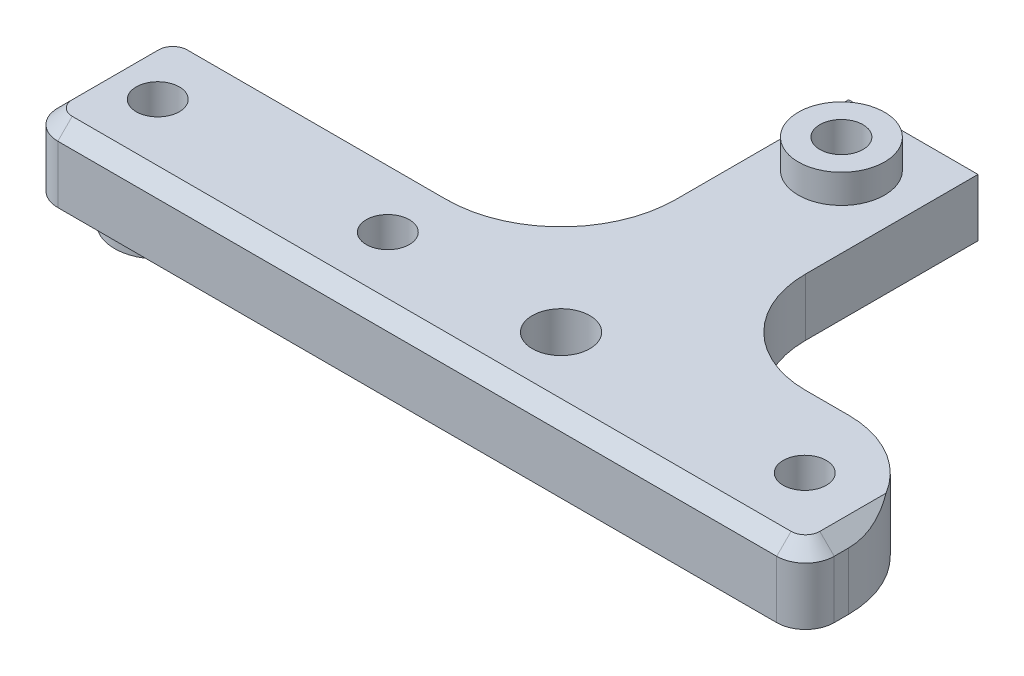
ISO-10303-21;
HEADER;
FILE_DESCRIPTION(('STEP AP214'),'2;1');
FILE_NAME('part.step','',(''),(''),'','','');
FILE_SCHEMA(('AUTOMOTIVE_DESIGN { 1 0 10303 214 1 1 1 1 }'));
ENDSEC;
DATA;
#1=APPLICATION_CONTEXT('core data for automotive mechanical design processes');
#2=APPLICATION_PROTOCOL_DEFINITION('international standard','automotive_design',2000,#1);
#3=PRODUCT_CONTEXT('',#1,'mechanical');
#4=PRODUCT('Part','Part','',(#3));
#5=PRODUCT_RELATED_PRODUCT_CATEGORY('part','',(#4));
#6=PRODUCT_DEFINITION_FORMATION('','',#4);
#7=PRODUCT_DEFINITION_CONTEXT('part definition',#1,'design');
#8=PRODUCT_DEFINITION('design','',#6,#7);
#9=PRODUCT_DEFINITION_SHAPE('','',#8);
#10=(LENGTH_UNIT() NAMED_UNIT(*) SI_UNIT(.MILLI.,.METRE.));
#11=(NAMED_UNIT(*) PLANE_ANGLE_UNIT() SI_UNIT($,.RADIAN.));
#12=(NAMED_UNIT(*) SI_UNIT($,.STERADIAN.) SOLID_ANGLE_UNIT());
#13=UNCERTAINTY_MEASURE_WITH_UNIT(LENGTH_MEASURE(1.E-05),#10,'distance_accuracy_value','');
#14=(GEOMETRIC_REPRESENTATION_CONTEXT(3) GLOBAL_UNCERTAINTY_ASSIGNED_CONTEXT((#13)) GLOBAL_UNIT_ASSIGNED_CONTEXT((#10,
#11,#12)) REPRESENTATION_CONTEXT('',''));
#15=CARTESIAN_POINT('',(0.,0.,0.));
#16=DIRECTION('',(0.,0.,1.));
#17=DIRECTION('',(1.,0.,0.));
#18=AXIS2_PLACEMENT_3D('',#15,#16,#17);
#19=CARTESIAN_POINT('',(-27.,5.,-5.));
#20=DIRECTION('',(0.,0.,1.));
#21=DIRECTION('',(1.,0.,0.));
#22=AXIS2_PLACEMENT_3D('',#19,#20,#21);
#23=PLANE('',#22);
#24=DIRECTION('',(-1.,0.,0.));
#25=VECTOR('',#24,1.);
#26=CARTESIAN_POINT('',(-27.,5.,-5.));
#27=LINE('',#26,#25);
#28=CARTESIAN_POINT('',(20.,5.,-5.));
#29=VERTEX_POINT('',#28);
#30=CARTESIAN_POINT('',(17.,5.,-5.));
#31=VERTEX_POINT('',#30);
#32=EDGE_CURVE('E266',#29,#31,#27,.T.);
#33=ORIENTED_EDGE('',*,*,#32,.F.);
#34=DIRECTION('',(0.,-1.,0.));
#35=VECTOR('',#34,1.);
#36=CARTESIAN_POINT('',(20.,5.,-5.));
#37=LINE('',#36,#35);
#38=CARTESIAN_POINT('',(20.,1.,-5.));
#39=VERTEX_POINT('',#38);
#40=EDGE_CURVE('E424',#29,#39,#37,.T.);
#41=ORIENTED_EDGE('',*,*,#40,.T.);
#42=DIRECTION('',(-1.,0.,0.));
#43=VECTOR('',#42,1.);
#44=CARTESIAN_POINT('',(-27.,1.,-5.));
#45=LINE('',#44,#43);
#46=CARTESIAN_POINT('',(17.,1.,-5.));
#47=VERTEX_POINT('',#46);
#48=EDGE_CURVE('E368',#39,#47,#45,.T.);
#49=ORIENTED_EDGE('',*,*,#48,.T.);
#50=DIRECTION('',(0.,-1.,0.));
#51=VECTOR('',#50,1.);
#52=CARTESIAN_POINT('',(17.,5.,-5.));
#53=LINE('',#52,#51);
#54=EDGE_CURVE('E339',#47,#31,#53,.F.);
#55=ORIENTED_EDGE('',*,*,#54,.T.);
#56=EDGE_LOOP('',(#33,#41,#49,#55));
#57=FACE_BOUND('',#56,.T.);
#58=ADVANCED_FACE('F47',(#57),#23,.F.);
#59=DIRECTION('',(0.,-1.,0.));
#60=VECTOR('',#59,1.);
#61=CARTESIAN_POINT('',(-25.,5.,-5.));
#62=LINE('',#61,#60);
#63=CARTESIAN_POINT('',(-25.,0.,-5.));
#64=VERTEX_POINT('',#63);
#65=CARTESIAN_POINT('',(-25.,4.00000000000001,-5.));
#66=VERTEX_POINT('',#65);
#67=EDGE_CURVE('E311',#64,#66,#62,.F.);
#68=ORIENTED_EDGE('',*,*,#67,.T.);
#69=DIRECTION('',(1.,0.,0.));
#70=VECTOR('',#69,1.);
#71=CARTESIAN_POINT('',(-7.00000000000001,4.00000000000001,-5.));
#72=LINE('',#71,#70);
#73=CARTESIAN_POINT('',(-7.00000000000001,4.00000000000001,-5.));
#74=VERTEX_POINT('',#73);
#75=EDGE_CURVE('E410',#66,#74,#72,.T.);
#76=ORIENTED_EDGE('',*,*,#75,.T.);
#77=DIRECTION('',(0.,1.,0.));
#78=VECTOR('',#77,1.);
#79=CARTESIAN_POINT('',(-7.00000000000001,0.,-5.));
#80=LINE('',#79,#78);
#81=CARTESIAN_POINT('',(-7.00000000000001,0.,-5.));
#82=VERTEX_POINT('',#81);
#83=EDGE_CURVE('E332',#74,#82,#80,.F.);
#84=ORIENTED_EDGE('',*,*,#83,.T.);
#85=DIRECTION('',(-1.,0.,0.));
#86=VECTOR('',#85,1.);
#87=CARTESIAN_POINT('',(-27.,0.,-5.));
#88=LINE('',#87,#86);
#89=EDGE_CURVE('E274',#82,#64,#88,.T.);
#90=ORIENTED_EDGE('',*,*,#89,.T.);
#91=EDGE_LOOP('',(#68,#76,#84,#90));
#92=FACE_BOUND('',#91,.T.);
#93=ADVANCED_FACE('F591',(#92),#23,.F.);
#94=CARTESIAN_POINT('',(27.,5.,-5.));
#95=DIRECTION('',(-1.,0.,0.));
#96=DIRECTION('',(0.,0.,1.));
#97=AXIS2_PLACEMENT_3D('',#94,#95,#96);
#98=PLANE('',#97);
#99=DIRECTION('',(0.,0.,-1.));
#100=VECTOR('',#99,1.);
#101=CARTESIAN_POINT('',(27.,0.,-5.));
#102=LINE('',#101,#100);
#103=CARTESIAN_POINT('',(27.,0.,3.));
#104=VERTEX_POINT('',#103);
#105=CARTESIAN_POINT('',(27.,0.,2.));
#106=VERTEX_POINT('',#105);
#107=EDGE_CURVE('E272',#104,#106,#102,.T.);
#108=ORIENTED_EDGE('',*,*,#107,.T.);
#109=DIRECTION('',(0.,-1.,0.));
#110=VECTOR('',#109,1.);
#111=CARTESIAN_POINT('',(27.,5.,2.));
#112=LINE('',#111,#110);
#113=CARTESIAN_POINT('',(27.,4.00000000000001,2.));
#114=VERTEX_POINT('',#113);
#115=EDGE_CURVE('E72',#106,#114,#112,.F.);
#116=ORIENTED_EDGE('',*,*,#115,.T.);
#117=DIRECTION('',(0.,0.,1.));
#118=VECTOR('',#117,1.);
#119=CARTESIAN_POINT('',(27.,4.00000000000001,3.));
#120=LINE('',#119,#118);
#121=CARTESIAN_POINT('',(27.,4.00000000000001,3.));
#122=VERTEX_POINT('',#121);
#123=EDGE_CURVE('E371',#114,#122,#120,.T.);
#124=ORIENTED_EDGE('',*,*,#123,.T.);
#125=DIRECTION('',(0.,-1.,0.));
#126=VECTOR('',#125,1.);
#127=CARTESIAN_POINT('',(27.,5.,3.));
#128=LINE('',#127,#126);
#129=EDGE_CURVE('E314',#122,#104,#128,.T.);
#130=ORIENTED_EDGE('',*,*,#129,.T.);
#131=EDGE_LOOP('',(#108,#116,#124,#130));
#132=FACE_BOUND('',#131,.T.);
#133=ADVANCED_FACE('F516',(#132),#98,.F.);
#134=CARTESIAN_POINT('',(-27.,5.,-5.));
#135=DIRECTION('',(1.,0.,0.));
#136=DIRECTION('',(0.,0.,-1.));
#137=AXIS2_PLACEMENT_3D('',#134,#135,#136);
#138=PLANE('',#137);
#139=DIRECTION('',(0.,-1.,0.));
#140=VECTOR('',#139,1.);
#141=CARTESIAN_POINT('',(-27.,5.,3.));
#142=LINE('',#141,#140);
#143=CARTESIAN_POINT('',(-27.,0.,3.));
#144=VERTEX_POINT('',#143);
#145=CARTESIAN_POINT('',(-27.,4.00000000000001,3.));
#146=VERTEX_POINT('',#145);
#147=EDGE_CURVE('E268',#144,#146,#142,.F.);
#148=ORIENTED_EDGE('',*,*,#147,.T.);
#149=DIRECTION('',(0.,0.,-1.));
#150=VECTOR('',#149,1.);
#151=CARTESIAN_POINT('',(-27.,4.00000000000001,-3.));
#152=LINE('',#151,#150);
#153=CARTESIAN_POINT('',(-27.,4.00000000000001,-3.));
#154=VERTEX_POINT('',#153);
#155=EDGE_CURVE('E411',#146,#154,#152,.T.);
#156=ORIENTED_EDGE('',*,*,#155,.T.);
#157=DIRECTION('',(0.,-1.,0.));
#158=VECTOR('',#157,1.);
#159=CARTESIAN_POINT('',(-27.,5.,-3.));
#160=LINE('',#159,#158);
#161=CARTESIAN_POINT('',(-27.,0.,-3.));
#162=VERTEX_POINT('',#161);
#163=EDGE_CURVE('E296',#154,#162,#160,.T.);
#164=ORIENTED_EDGE('',*,*,#163,.T.);
#165=DIRECTION('',(0.,0.,1.));
#166=VECTOR('',#165,1.);
#167=CARTESIAN_POINT('',(-27.,0.,-5.));
#168=LINE('',#167,#166);
#169=EDGE_CURVE('E276',#162,#144,#168,.T.);
#170=ORIENTED_EDGE('',*,*,#169,.T.);
#171=EDGE_LOOP('',(#148,#156,#164,#170));
#172=FACE_BOUND('',#171,.T.);
#173=ADVANCED_FACE('F536',(#172),#138,.F.);
#174=CARTESIAN_POINT('',(-27.,5.,5.));
#175=DIRECTION('',(0.,0.,-1.));
#176=DIRECTION('',(-1.,0.,0.));
#177=AXIS2_PLACEMENT_3D('',#174,#175,#176);
#178=PLANE('',#177);
#179=DIRECTION('',(0.,-1.,0.));
#180=VECTOR('',#179,1.);
#181=CARTESIAN_POINT('',(25.,5.,5.));
#182=LINE('',#181,#180);
#183=CARTESIAN_POINT('',(25.,0.,5.));
#184=VERTEX_POINT('',#183);
#185=CARTESIAN_POINT('',(25.,4.00000000000001,5.));
#186=VERTEX_POINT('',#185);
#187=EDGE_CURVE('E248',#184,#186,#182,.F.);
#188=ORIENTED_EDGE('',*,*,#187,.T.);
#189=DIRECTION('',(-1.,0.,0.));
#190=VECTOR('',#189,1.);
#191=CARTESIAN_POINT('',(-25.,4.00000000000001,5.));
#192=LINE('',#191,#190);
#193=CARTESIAN_POINT('',(-25.,4.00000000000001,5.));
#194=VERTEX_POINT('',#193);
#195=EDGE_CURVE('E418',#186,#194,#192,.T.);
#196=ORIENTED_EDGE('',*,*,#195,.T.);
#197=DIRECTION('',(0.,-1.,0.));
#198=VECTOR('',#197,1.);
#199=CARTESIAN_POINT('',(-25.,5.,5.));
#200=LINE('',#199,#198);
#201=CARTESIAN_POINT('',(-25.,0.,5.));
#202=VERTEX_POINT('',#201);
#203=EDGE_CURVE('E319',#194,#202,#200,.T.);
#204=ORIENTED_EDGE('',*,*,#203,.T.);
#205=DIRECTION('',(1.,0.,0.));
#206=VECTOR('',#205,1.);
#207=CARTESIAN_POINT('',(-27.,0.,5.));
#208=LINE('',#207,#206);
#209=EDGE_CURVE('E270',#202,#184,#208,.T.);
#210=ORIENTED_EDGE('',*,*,#209,.T.);
#211=EDGE_LOOP('',(#188,#196,#204,#210));
#212=FACE_BOUND('',#211,.T.);
#213=ADVANCED_FACE('F527',(#212),#178,.F.);
#214=CARTESIAN_POINT('',(0.,5.,0.));
#215=DIRECTION('',(0.,1.,0.));
#216=DIRECTION('',(0.,0.,1.));
#217=AXIS2_PLACEMENT_3D('',#214,#215,#216);
#218=PLANE('',#217);
#219=CARTESIAN_POINT('',(4.99999999999999,5.,-19.5));
#220=DIRECTION('',(0.,1.,0.));
#221=DIRECTION('',(0.,0.,1.));
#222=AXIS2_PLACEMENT_3D('',#219,#220,#221);
#223=CIRCLE('',#222,3.);
#224=CARTESIAN_POINT('',(4.99999999999999,5.,-16.5));
#225=VERTEX_POINT('',#224);
#226=EDGE_CURVE('E247',#225,#225,#223,.T.);
#227=ORIENTED_EDGE('',*,*,#226,.F.);
#228=EDGE_LOOP('',(#227));
#229=FACE_BOUND('',#228,.T.);
#230=CARTESIAN_POINT('',(-23.05,5.,0.));
#231=DIRECTION('',(0.,1.,0.));
#232=DIRECTION('',(0.,0.,1.));
#233=AXIS2_PLACEMENT_3D('',#230,#231,#232);
#234=CIRCLE('',#233,1.5);
#235=CARTESIAN_POINT('',(-23.05,5.,1.5));
#236=VERTEX_POINT('',#235);
#237=EDGE_CURVE('E249',#236,#236,#234,.T.);
#238=ORIENTED_EDGE('',*,*,#237,.F.);
#239=EDGE_LOOP('',(#238));
#240=FACE_BOUND('',#239,.T.);
#241=CARTESIAN_POINT('',(5.,5.,0.));
#242=DIRECTION('',(0.,1.,0.));
#243=DIRECTION('',(0.,0.,1.));
#244=AXIS2_PLACEMENT_3D('',#241,#242,#243);
#245=CIRCLE('',#244,2.);
#246=CARTESIAN_POINT('',(5.,5.,2.));
#247=VERTEX_POINT('',#246);
#248=EDGE_CURVE('E253',#247,#247,#245,.T.);
#249=ORIENTED_EDGE('',*,*,#248,.F.);
#250=EDGE_LOOP('',(#249));
#251=FACE_BOUND('',#250,.T.);
#252=CARTESIAN_POINT('',(-7.05,5.,0.));
#253=DIRECTION('',(0.,1.,0.));
#254=DIRECTION('',(0.,0.,1.));
#255=AXIS2_PLACEMENT_3D('',#252,#253,#254);
#256=CIRCLE('',#255,1.5);
#257=CARTESIAN_POINT('',(-7.05,5.,1.5));
#258=VERTEX_POINT('',#257);
#259=EDGE_CURVE('E259',#258,#258,#256,.T.);
#260=ORIENTED_EDGE('',*,*,#259,.F.);
#261=EDGE_LOOP('',(#260));
#262=FACE_BOUND('',#261,.T.);
#263=CARTESIAN_POINT('',(21.95,5.,0.));
#264=DIRECTION('',(0.,1.,0.));
#265=DIRECTION('',(0.,0.,1.));
#266=AXIS2_PLACEMENT_3D('',#263,#264,#265);
#267=CIRCLE('',#266,1.5);
#268=CARTESIAN_POINT('',(21.95,5.,1.5));
#269=VERTEX_POINT('',#268);
#270=EDGE_CURVE('E243',#269,#269,#267,.T.);
#271=ORIENTED_EDGE('',*,*,#270,.F.);
#272=EDGE_LOOP('',(#271));
#273=FACE_BOUND('',#272,.T.);
#274=DIRECTION('',(0.,0.,-1.));
#275=VECTOR('',#274,1.);
#276=CARTESIAN_POINT('',(26.,5.,-5.));
#277=LINE('',#276,#275);
#278=CARTESIAN_POINT('',(26.,5.,3.));
#279=VERTEX_POINT('',#278);
#280=CARTESIAN_POINT('',(26.,5.,-1.60555127546398));
#281=VERTEX_POINT('',#280);
#282=EDGE_CURVE('E372',#279,#281,#277,.T.);
#283=ORIENTED_EDGE('',*,*,#282,.T.);
#284=CARTESIAN_POINT('',(20.,5.,2.));
#285=DIRECTION('',(0.,1.,0.));
#286=DIRECTION('',(0.,0.,1.));
#287=AXIS2_PLACEMENT_3D('',#284,#285,#286);
#288=CIRCLE('',#287,7.);
#289=EDGE_CURVE('E11',#281,#29,#288,.T.);
#290=ORIENTED_EDGE('',*,*,#289,.T.);
#291=ORIENTED_EDGE('',*,*,#32,.T.);
#292=CARTESIAN_POINT('',(17.,5.,-12.));
#293=DIRECTION('',(0.,1.,0.));
#294=DIRECTION('',(0.,0.,1.));
#295=AXIS2_PLACEMENT_3D('',#292,#293,#294);
#296=CIRCLE('',#295,7.);
#297=CARTESIAN_POINT('',(9.99999999999999,5.,-12.));
#298=VERTEX_POINT('',#297);
#299=EDGE_CURVE('E342',#31,#298,#296,.F.);
#300=ORIENTED_EDGE('',*,*,#299,.T.);
#301=DIRECTION('',(0.,0.,1.));
#302=VECTOR('',#301,1.);
#303=CARTESIAN_POINT('',(9.99999999999999,5.,-24.));
#304=LINE('',#303,#302);
#305=CARTESIAN_POINT('',(9.99999999999999,5.,-24.));
#306=VERTEX_POINT('',#305);
#307=EDGE_CURVE('E219',#306,#298,#304,.T.);
#308=ORIENTED_EDGE('',*,*,#307,.F.);
#309=DIRECTION('',(1.,0.,0.));
#310=VECTOR('',#309,1.);
#311=CARTESIAN_POINT('',(9.99999999999999,5.,-24.));
#312=LINE('',#311,#310);
#313=CARTESIAN_POINT('',(0.999999999999987,5.,-24.));
#314=VERTEX_POINT('',#313);
#315=EDGE_CURVE('E228',#314,#306,#312,.T.);
#316=ORIENTED_EDGE('',*,*,#315,.F.);
#317=DIRECTION('',(0.,0.,1.));
#318=VECTOR('',#317,1.);
#319=CARTESIAN_POINT('',(0.999999999999987,5.,-12.));
#320=LINE('',#319,#318);
#321=CARTESIAN_POINT('',(0.999999999999987,5.,-12.));
#322=VERTEX_POINT('',#321);
#323=EDGE_CURVE('E399',#314,#322,#320,.T.);
#324=ORIENTED_EDGE('',*,*,#323,.T.);
#325=CARTESIAN_POINT('',(-7.00000000000001,5.,-12.));
#326=DIRECTION('',(0.,1.,0.));
#327=DIRECTION('',(0.,0.,1.));
#328=AXIS2_PLACEMENT_3D('',#325,#326,#327);
#329=CIRCLE('',#328,7.99999999999999);
#330=CARTESIAN_POINT('',(-7.00000000000001,5.,-4.00000000000001));
#331=VERTEX_POINT('',#330);
#332=EDGE_CURVE('E394',#322,#331,#329,.F.);
#333=ORIENTED_EDGE('',*,*,#332,.T.);
#334=DIRECTION('',(-1.,0.,0.));
#335=VECTOR('',#334,1.);
#336=CARTESIAN_POINT('',(-25.,5.,-4.00000000000001));
#337=LINE('',#336,#335);
#338=CARTESIAN_POINT('',(-25.,5.,-4.));
#339=VERTEX_POINT('',#338);
#340=EDGE_CURVE('E395',#331,#339,#337,.T.);
#341=ORIENTED_EDGE('',*,*,#340,.T.);
#342=CARTESIAN_POINT('',(-25.,5.,-3.));
#343=DIRECTION('',(0.,1.,0.));
#344=DIRECTION('',(0.,0.,1.));
#345=AXIS2_PLACEMENT_3D('',#342,#343,#344);
#346=CIRCLE('',#345,1.);
#347=CARTESIAN_POINT('',(-26.,5.,-3.));
#348=VERTEX_POINT('',#347);
#349=EDGE_CURVE('E389',#339,#348,#346,.T.);
#350=ORIENTED_EDGE('',*,*,#349,.T.);
#351=DIRECTION('',(0.,0.,1.));
#352=VECTOR('',#351,1.);
#353=CARTESIAN_POINT('',(-26.,5.,3.));
#354=LINE('',#353,#352);
#355=CARTESIAN_POINT('',(-26.,5.,3.));
#356=VERTEX_POINT('',#355);
#357=EDGE_CURVE('E388',#348,#356,#354,.T.);
#358=ORIENTED_EDGE('',*,*,#357,.T.);
#359=CARTESIAN_POINT('',(-25.,5.,3.));
#360=DIRECTION('',(0.,1.,0.));
#361=DIRECTION('',(0.,0.,1.));
#362=AXIS2_PLACEMENT_3D('',#359,#360,#361);
#363=CIRCLE('',#362,1.);
#364=CARTESIAN_POINT('',(-25.,5.,4.00000000000001));
#365=VERTEX_POINT('',#364);
#366=EDGE_CURVE('E384',#356,#365,#363,.T.);
#367=ORIENTED_EDGE('',*,*,#366,.T.);
#368=DIRECTION('',(1.,0.,0.));
#369=VECTOR('',#368,1.);
#370=CARTESIAN_POINT('',(25.,5.,4.00000000000001));
#371=LINE('',#370,#369);
#372=CARTESIAN_POINT('',(25.,5.,4.));
#373=VERTEX_POINT('',#372);
#374=EDGE_CURVE('E379',#365,#373,#371,.T.);
#375=ORIENTED_EDGE('',*,*,#374,.T.);
#376=CARTESIAN_POINT('',(25.,5.,3.));
#377=DIRECTION('',(0.,1.,0.));
#378=DIRECTION('',(0.,0.,1.));
#379=AXIS2_PLACEMENT_3D('',#376,#377,#378);
#380=CIRCLE('',#379,1.);
#381=EDGE_CURVE('E380',#373,#279,#380,.T.);
#382=ORIENTED_EDGE('',*,*,#381,.T.);
#383=EDGE_LOOP('',(#283,#290,#291,#300,#308,#316,#324,#333,#341,#350,#358,#367,#375,#382));
#384=FACE_BOUND('',#383,.T.);
#385=ADVANCED_FACE('F509',(#229,#240,#251,#262,#273,#384),#218,.T.);
#386=CARTESIAN_POINT('',(0.,0.,0.));
#387=DIRECTION('',(0.,1.,0.));
#388=DIRECTION('',(0.,0.,1.));
#389=AXIS2_PLACEMENT_3D('',#386,#387,#388);
#390=PLANE('',#389);
#391=CARTESIAN_POINT('',(4.99999999999999,0.,-19.5));
#392=DIRECTION('',(0.,1.,0.));
#393=DIRECTION('',(0.,0.,1.));
#394=AXIS2_PLACEMENT_3D('',#391,#392,#393);
#395=CIRCLE('',#394,1.5);
#396=CARTESIAN_POINT('',(4.99999999999999,0.,-18.));
#397=VERTEX_POINT('',#396);
#398=EDGE_CURVE('E324',#397,#397,#395,.T.);
#399=ORIENTED_EDGE('',*,*,#398,.T.);
#400=EDGE_LOOP('',(#399));
#401=FACE_BOUND('',#400,.T.);
#402=CARTESIAN_POINT('',(-23.05,0.,0.));
#403=DIRECTION('',(0.,-1.,0.));
#404=DIRECTION('',(0.,0.,-1.));
#405=AXIS2_PLACEMENT_3D('',#402,#403,#404);
#406=CIRCLE('',#405,3.);
#407=CARTESIAN_POINT('',(-23.05,0.,-3.));
#408=VERTEX_POINT('',#407);
#409=EDGE_CURVE('E242',#408,#408,#406,.T.);
#410=ORIENTED_EDGE('',*,*,#409,.F.);
#411=EDGE_LOOP('',(#410));
#412=FACE_BOUND('',#411,.T.);
#413=CARTESIAN_POINT('',(5.,0.,0.));
#414=DIRECTION('',(0.,1.,0.));
#415=DIRECTION('',(0.,0.,1.));
#416=AXIS2_PLACEMENT_3D('',#413,#414,#415);
#417=CIRCLE('',#416,2.);
#418=CARTESIAN_POINT('',(5.,0.,2.));
#419=VERTEX_POINT('',#418);
#420=EDGE_CURVE('E273',#419,#419,#417,.T.);
#421=ORIENTED_EDGE('',*,*,#420,.T.);
#422=EDGE_LOOP('',(#421));
#423=FACE_BOUND('',#422,.T.);
#424=CARTESIAN_POINT('',(-7.05,0.,0.));
#425=DIRECTION('',(0.,1.,0.));
#426=DIRECTION('',(0.,0.,1.));
#427=AXIS2_PLACEMENT_3D('',#424,#425,#426);
#428=CIRCLE('',#427,1.5);
#429=CARTESIAN_POINT('',(-7.05,0.,1.5));
#430=VERTEX_POINT('',#429);
#431=EDGE_CURVE('E289',#430,#430,#428,.T.);
#432=ORIENTED_EDGE('',*,*,#431,.T.);
#433=EDGE_LOOP('',(#432));
#434=FACE_BOUND('',#433,.T.);
#435=CARTESIAN_POINT('',(21.95,0.,0.));
#436=DIRECTION('',(0.,1.,0.));
#437=DIRECTION('',(0.,0.,1.));
#438=AXIS2_PLACEMENT_3D('',#435,#436,#437);
#439=CIRCLE('',#438,1.5);
#440=CARTESIAN_POINT('',(21.95,0.,1.5));
#441=VERTEX_POINT('',#440);
#442=EDGE_CURVE('E251',#441,#441,#439,.T.);
#443=ORIENTED_EDGE('',*,*,#442,.T.);
#444=EDGE_LOOP('',(#443));
#445=FACE_BOUND('',#444,.T.);
#446=DIRECTION('',(1.,0.,0.));
#447=VECTOR('',#446,1.);
#448=CARTESIAN_POINT('',(0.,0.,-4.));
#449=LINE('',#448,#447);
#450=CARTESIAN_POINT('',(17.,0.,-4.));
#451=VERTEX_POINT('',#450);
#452=CARTESIAN_POINT('',(23.605551275464,0.,-4.));
#453=VERTEX_POINT('',#452);
#454=EDGE_CURVE('E346',#451,#453,#449,.T.);
#455=ORIENTED_EDGE('',*,*,#454,.T.);
#456=CARTESIAN_POINT('',(20.,0.,2.));
#457=DIRECTION('',(0.,1.,0.));
#458=DIRECTION('',(0.,0.,1.));
#459=AXIS2_PLACEMENT_3D('',#456,#457,#458);
#460=CIRCLE('',#459,7.);
#461=EDGE_CURVE('E468',#453,#106,#460,.F.);
#462=ORIENTED_EDGE('',*,*,#461,.T.);
#463=ORIENTED_EDGE('',*,*,#107,.F.);
#464=CARTESIAN_POINT('',(25.,0.,3.));
#465=DIRECTION('',(0.,1.,0.));
#466=DIRECTION('',(0.,0.,1.));
#467=AXIS2_PLACEMENT_3D('',#464,#465,#466);
#468=CIRCLE('',#467,2.);
#469=EDGE_CURVE('E302',#104,#184,#468,.F.);
#470=ORIENTED_EDGE('',*,*,#469,.T.);
#471=ORIENTED_EDGE('',*,*,#209,.F.);
#472=CARTESIAN_POINT('',(-25.,0.,3.));
#473=DIRECTION('',(0.,1.,0.));
#474=DIRECTION('',(0.,0.,1.));
#475=AXIS2_PLACEMENT_3D('',#472,#473,#474);
#476=CIRCLE('',#475,2.);
#477=EDGE_CURVE('E301',#202,#144,#476,.F.);
#478=ORIENTED_EDGE('',*,*,#477,.T.);
#479=ORIENTED_EDGE('',*,*,#169,.F.);
#480=CARTESIAN_POINT('',(-25.,0.,-3.));
#481=DIRECTION('',(0.,1.,0.));
#482=DIRECTION('',(0.,0.,1.));
#483=AXIS2_PLACEMENT_3D('',#480,#481,#482);
#484=CIRCLE('',#483,2.);
#485=EDGE_CURVE('E310',#162,#64,#484,.F.);
#486=ORIENTED_EDGE('',*,*,#485,.T.);
#487=ORIENTED_EDGE('',*,*,#89,.F.);
#488=CARTESIAN_POINT('',(-7.00000000000001,0.,-12.));
#489=DIRECTION('',(0.,1.,0.));
#490=DIRECTION('',(0.,0.,1.));
#491=AXIS2_PLACEMENT_3D('',#488,#489,#490);
#492=CIRCLE('',#491,7.);
#493=CARTESIAN_POINT('',(0.,0.,-12.));
#494=VERTEX_POINT('',#493);
#495=EDGE_CURVE('E214',#82,#494,#492,.T.);
#496=ORIENTED_EDGE('',*,*,#495,.T.);
#497=DIRECTION('',(0.,0.,1.));
#498=VECTOR('',#497,1.);
#499=CARTESIAN_POINT('',(0.,0.,-24.));
#500=LINE('',#499,#498);
#501=CARTESIAN_POINT('',(0.,0.,-24.));
#502=VERTEX_POINT('',#501);
#503=EDGE_CURVE('E209',#502,#494,#500,.T.);
#504=ORIENTED_EDGE('',*,*,#503,.F.);
#505=DIRECTION('',(-1.,0.,0.));
#506=VECTOR('',#505,1.);
#507=CARTESIAN_POINT('',(9.99999999999999,0.,-24.));
#508=LINE('',#507,#506);
#509=CARTESIAN_POINT('',(8.99999999999999,0.,-24.));
#510=VERTEX_POINT('',#509);
#511=EDGE_CURVE('E191',#510,#502,#508,.T.);
#512=ORIENTED_EDGE('',*,*,#511,.F.);
#513=DIRECTION('',(0.,0.,1.));
#514=VECTOR('',#513,1.);
#515=CARTESIAN_POINT('',(8.99999999999999,0.,0.));
#516=LINE('',#515,#514);
#517=CARTESIAN_POINT('',(8.99999999999999,0.,-12.));
#518=VERTEX_POINT('',#517);
#519=EDGE_CURVE('E353',#510,#518,#516,.T.);
#520=ORIENTED_EDGE('',*,*,#519,.T.);
#521=CARTESIAN_POINT('',(17.,0.,-12.));
#522=DIRECTION('',(0.,1.,0.));
#523=DIRECTION('',(0.,0.,1.));
#524=AXIS2_PLACEMENT_3D('',#521,#522,#523);
#525=CIRCLE('',#524,8.);
#526=EDGE_CURVE('E351',#518,#451,#525,.T.);
#527=ORIENTED_EDGE('',*,*,#526,.T.);
#528=EDGE_LOOP('',(#455,#462,#463,#470,#471,#478,#479,#486,#487,#496,#504,#512,#520,#527));
#529=FACE_BOUND('',#528,.T.);
#530=ADVANCED_FACE('F213',(#401,#412,#423,#434,#445,#529),#390,.F.);
#531=CARTESIAN_POINT('',(21.95,-2.,0.));
#532=DIRECTION('',(0.,1.,0.));
#533=DIRECTION('',(0.,0.,1.));
#534=AXIS2_PLACEMENT_3D('',#531,#532,#533);
#535=CYLINDRICAL_SURFACE('',#534,1.5);
#536=ORIENTED_EDGE('',*,*,#270,.T.);
#537=EDGE_LOOP('',(#536));
#538=FACE_BOUND('',#537,.T.);
#539=ORIENTED_EDGE('',*,*,#442,.F.);
#540=EDGE_LOOP('',(#539));
#541=FACE_BOUND('',#540,.T.);
#542=ADVANCED_FACE('F714',(#538,#541),#535,.F.);
#543=CARTESIAN_POINT('',(-7.05,-2.,0.));
#544=DIRECTION('',(0.,1.,0.));
#545=DIRECTION('',(0.,0.,1.));
#546=AXIS2_PLACEMENT_3D('',#543,#544,#545);
#547=CYLINDRICAL_SURFACE('',#546,1.5);
#548=ORIENTED_EDGE('',*,*,#259,.T.);
#549=EDGE_LOOP('',(#548));
#550=FACE_BOUND('',#549,.T.);
#551=ORIENTED_EDGE('',*,*,#431,.F.);
#552=EDGE_LOOP('',(#551));
#553=FACE_BOUND('',#552,.T.);
#554=ADVANCED_FACE('F936',(#550,#553),#547,.F.);
#555=CARTESIAN_POINT('',(5.,-2.,0.));
#556=DIRECTION('',(0.,1.,0.));
#557=DIRECTION('',(0.,0.,1.));
#558=AXIS2_PLACEMENT_3D('',#555,#556,#557);
#559=CYLINDRICAL_SURFACE('',#558,2.);
#560=ORIENTED_EDGE('',*,*,#248,.T.);
#561=EDGE_LOOP('',(#560));
#562=FACE_BOUND('',#561,.T.);
#563=ORIENTED_EDGE('',*,*,#420,.F.);
#564=EDGE_LOOP('',(#563));
#565=FACE_BOUND('',#564,.T.);
#566=ADVANCED_FACE('F930',(#562,#565),#559,.F.);
#567=CARTESIAN_POINT('',(-23.05,-2.,0.));
#568=DIRECTION('',(0.,1.,0.));
#569=DIRECTION('',(0.,0.,1.));
#570=AXIS2_PLACEMENT_3D('',#567,#568,#569);
#571=CYLINDRICAL_SURFACE('',#570,1.5);
#572=ORIENTED_EDGE('',*,*,#237,.T.);
#573=EDGE_LOOP('',(#572));
#574=FACE_BOUND('',#573,.T.);
#575=CARTESIAN_POINT('',(-23.05,-2.5,0.));
#576=DIRECTION('',(0.,-1.,0.));
#577=DIRECTION('',(0.,0.,-1.));
#578=AXIS2_PLACEMENT_3D('',#575,#576,#577);
#579=CIRCLE('',#578,1.5);
#580=CARTESIAN_POINT('',(-23.05,-2.5,-1.5));
#581=VERTEX_POINT('',#580);
#582=EDGE_CURVE('E217',#581,#581,#579,.T.);
#583=ORIENTED_EDGE('',*,*,#582,.T.);
#584=EDGE_LOOP('',(#583));
#585=FACE_BOUND('',#584,.T.);
#586=ADVANCED_FACE('F605',(#574,#585),#571,.F.);
#587=CARTESIAN_POINT('',(-25.,5.,-3.));
#588=DIRECTION('',(0.,-1.,0.));
#589=DIRECTION('',(0.,0.,-1.));
#590=AXIS2_PLACEMENT_3D('',#587,#588,#589);
#591=CYLINDRICAL_SURFACE('',#590,2.);
#592=ORIENTED_EDGE('',*,*,#163,.F.);
#593=CARTESIAN_POINT('',(-25.,4.00000000000001,-3.));
#594=DIRECTION('',(0.,1.,0.));
#595=DIRECTION('',(0.,0.,1.));
#596=AXIS2_PLACEMENT_3D('',#593,#594,#595);
#597=CIRCLE('',#596,2.);
#598=EDGE_CURVE('E407',#154,#66,#597,.F.);
#599=ORIENTED_EDGE('',*,*,#598,.T.);
#600=ORIENTED_EDGE('',*,*,#67,.F.);
#601=ORIENTED_EDGE('',*,*,#485,.F.);
#602=EDGE_LOOP('',(#592,#599,#600,#601));
#603=FACE_BOUND('',#602,.T.);
#604=ADVANCED_FACE('F546',(#603),#591,.T.);
#605=CARTESIAN_POINT('',(25.,5.,3.));
#606=DIRECTION('',(0.,-1.,0.));
#607=DIRECTION('',(0.,0.,-1.));
#608=AXIS2_PLACEMENT_3D('',#605,#606,#607);
#609=CYLINDRICAL_SURFACE('',#608,2.);
#610=ORIENTED_EDGE('',*,*,#129,.F.);
#611=CARTESIAN_POINT('',(25.,4.00000000000001,3.));
#612=DIRECTION('',(0.,1.,0.));
#613=DIRECTION('',(0.,0.,1.));
#614=AXIS2_PLACEMENT_3D('',#611,#612,#613);
#615=CIRCLE('',#614,2.);
#616=EDGE_CURVE('E422',#122,#186,#615,.F.);
#617=ORIENTED_EDGE('',*,*,#616,.T.);
#618=ORIENTED_EDGE('',*,*,#187,.F.);
#619=ORIENTED_EDGE('',*,*,#469,.F.);
#620=EDGE_LOOP('',(#610,#617,#618,#619));
#621=FACE_BOUND('',#620,.T.);
#622=ADVANCED_FACE('F522',(#621),#609,.T.);
#623=CARTESIAN_POINT('',(-25.,5.,3.));
#624=DIRECTION('',(0.,-1.,0.));
#625=DIRECTION('',(0.,0.,-1.));
#626=AXIS2_PLACEMENT_3D('',#623,#624,#625);
#627=CYLINDRICAL_SURFACE('',#626,2.);
#628=ORIENTED_EDGE('',*,*,#203,.F.);
#629=CARTESIAN_POINT('',(-25.,4.00000000000001,3.));
#630=DIRECTION('',(0.,1.,0.));
#631=DIRECTION('',(0.,0.,1.));
#632=AXIS2_PLACEMENT_3D('',#629,#630,#631);
#633=CIRCLE('',#632,2.);
#634=EDGE_CURVE('E416',#194,#146,#633,.F.);
#635=ORIENTED_EDGE('',*,*,#634,.T.);
#636=ORIENTED_EDGE('',*,*,#147,.F.);
#637=ORIENTED_EDGE('',*,*,#477,.F.);
#638=EDGE_LOOP('',(#628,#635,#636,#637));
#639=FACE_BOUND('',#638,.T.);
#640=ADVANCED_FACE('F533',(#639),#627,.T.);
#641=CARTESIAN_POINT('',(-23.05,-2.5,0.));
#642=DIRECTION('',(0.,-1.,0.));
#643=DIRECTION('',(0.,0.,-1.));
#644=AXIS2_PLACEMENT_3D('',#641,#642,#643);
#645=PLANE('',#644);
#646=CARTESIAN_POINT('',(-23.05,-2.5,0.));
#647=DIRECTION('',(0.,-1.,0.));
#648=DIRECTION('',(0.,0.,-1.));
#649=AXIS2_PLACEMENT_3D('',#646,#647,#648);
#650=CIRCLE('',#649,3.);
#651=CARTESIAN_POINT('',(-23.05,-2.5,-3.));
#652=VERTEX_POINT('',#651);
#653=EDGE_CURVE('E237',#652,#652,#650,.T.);
#654=ORIENTED_EDGE('',*,*,#653,.T.);
#655=EDGE_LOOP('',(#654));
#656=FACE_BOUND('',#655,.T.);
#657=ORIENTED_EDGE('',*,*,#582,.F.);
#658=EDGE_LOOP('',(#657));
#659=FACE_BOUND('',#658,.T.);
#660=ADVANCED_FACE('F610',(#656,#659),#645,.T.);
#661=CARTESIAN_POINT('',(-23.05,-2.5,0.));
#662=DIRECTION('',(0.,1.,0.));
#663=DIRECTION('',(0.,0.,1.));
#664=AXIS2_PLACEMENT_3D('',#661,#662,#663);
#665=CYLINDRICAL_SURFACE('',#664,3.);
#666=ORIENTED_EDGE('',*,*,#653,.F.);
#667=EDGE_LOOP('',(#666));
#668=FACE_BOUND('',#667,.T.);
#669=ORIENTED_EDGE('',*,*,#409,.T.);
#670=EDGE_LOOP('',(#669));
#671=FACE_BOUND('',#670,.T.);
#672=ADVANCED_FACE('F754',(#668,#671),#665,.T.);
#673=CARTESIAN_POINT('',(9.99999999999999,5.,-24.));
#674=DIRECTION('',(-1.,0.,0.));
#675=DIRECTION('',(0.,-1.,0.));
#676=AXIS2_PLACEMENT_3D('',#673,#674,#675);
#677=PLANE('',#676);
#678=DIRECTION('',(0.,-1.,0.));
#679=VECTOR('',#678,1.);
#680=CARTESIAN_POINT('',(9.99999999999999,0.,-12.));
#681=LINE('',#680,#679);
#682=CARTESIAN_POINT('',(9.99999999999999,0.999999999999999,-12.));
#683=VERTEX_POINT('',#682);
#684=EDGE_CURVE('E335',#298,#683,#681,.T.);
#685=ORIENTED_EDGE('',*,*,#684,.T.);
#686=DIRECTION('',(0.,0.,-1.));
#687=VECTOR('',#686,1.);
#688=CARTESIAN_POINT('',(9.99999999999999,1.,-24.));
#689=LINE('',#688,#687);
#690=CARTESIAN_POINT('',(9.99999999999999,1.,-24.));
#691=VERTEX_POINT('',#690);
#692=EDGE_CURVE('E357',#683,#691,#689,.T.);
#693=ORIENTED_EDGE('',*,*,#692,.T.);
#694=DIRECTION('',(0.,-1.,0.));
#695=VECTOR('',#694,1.);
#696=CARTESIAN_POINT('',(9.99999999999999,5.,-24.));
#697=LINE('',#696,#695);
#698=EDGE_CURVE('E207',#306,#691,#697,.T.);
#699=ORIENTED_EDGE('',*,*,#698,.F.);
#700=ORIENTED_EDGE('',*,*,#307,.T.);
#701=EDGE_LOOP('',(#685,#693,#699,#700));
#702=FACE_BOUND('',#701,.T.);
#703=ADVANCED_FACE('F507',(#702),#677,.F.);
#704=CARTESIAN_POINT('',(0.,5.,-24.));
#705=DIRECTION('',(1.,0.,0.));
#706=DIRECTION('',(0.,0.,-1.));
#707=AXIS2_PLACEMENT_3D('',#704,#705,#706);
#708=PLANE('',#707);
#709=DIRECTION('',(0.,1.,0.));
#710=VECTOR('',#709,1.);
#711=CARTESIAN_POINT('',(0.,5.,-12.));
#712=LINE('',#711,#710);
#713=CARTESIAN_POINT('',(0.,4.00000000000001,-12.));
#714=VERTEX_POINT('',#713);
#715=EDGE_CURVE('E327',#494,#714,#712,.T.);
#716=ORIENTED_EDGE('',*,*,#715,.T.);
#717=DIRECTION('',(0.,0.,-1.));
#718=VECTOR('',#717,1.);
#719=CARTESIAN_POINT('',(0.,4.00000000000001,-24.));
#720=LINE('',#719,#718);
#721=CARTESIAN_POINT('',(0.,4.00000000000001,-24.));
#722=VERTEX_POINT('',#721);
#723=EDGE_CURVE('E223',#714,#722,#720,.T.);
#724=ORIENTED_EDGE('',*,*,#723,.T.);
#725=DIRECTION('',(0.,1.,0.));
#726=VECTOR('',#725,1.);
#727=CARTESIAN_POINT('',(0.,5.,-24.));
#728=LINE('',#727,#726);
#729=EDGE_CURVE('E196',#502,#722,#728,.T.);
#730=ORIENTED_EDGE('',*,*,#729,.F.);
#731=ORIENTED_EDGE('',*,*,#503,.T.);
#732=EDGE_LOOP('',(#716,#724,#730,#731));
#733=FACE_BOUND('',#732,.T.);
#734=ADVANCED_FACE('F222',(#733),#708,.F.);
#735=CARTESIAN_POINT('',(0.,0.,-24.));
#736=DIRECTION('',(0.,0.,-1.));
#737=DIRECTION('',(-1.,0.,0.));
#738=AXIS2_PLACEMENT_3D('',#735,#736,#737);
#739=PLANE('',#738);
#740=ORIENTED_EDGE('',*,*,#698,.T.);
#741=DIRECTION('',(0.707106781186548,0.707106781186547,0.));
#742=VECTOR('',#741,1.);
#743=CARTESIAN_POINT('',(4.49999999999999,-4.5,-24.));
#744=LINE('',#743,#742);
#745=EDGE_CURVE('E201',#691,#510,#744,.F.);
#746=ORIENTED_EDGE('',*,*,#745,.T.);
#747=ORIENTED_EDGE('',*,*,#511,.T.);
#748=ORIENTED_EDGE('',*,*,#729,.T.);
#749=DIRECTION('',(0.707106781186548,0.707106781186548,0.));
#750=VECTOR('',#749,1.);
#751=CARTESIAN_POINT('',(-2.00000000000001,2.00000000000001,-24.));
#752=LINE('',#751,#750);
#753=EDGE_CURVE('E359',#722,#314,#752,.T.);
#754=ORIENTED_EDGE('',*,*,#753,.T.);
#755=ORIENTED_EDGE('',*,*,#315,.T.);
#756=EDGE_LOOP('',(#740,#746,#747,#748,#754,#755));
#757=FACE_BOUND('',#756,.T.);
#758=ADVANCED_FACE('F198',(#757),#739,.T.);
#759=CARTESIAN_POINT('',(4.99999999999999,-5.,-19.5));
#760=DIRECTION('',(0.,1.,0.));
#761=DIRECTION('',(0.,0.,1.));
#762=AXIS2_PLACEMENT_3D('',#759,#760,#761);
#763=CYLINDRICAL_SURFACE('',#762,1.5);
#764=ORIENTED_EDGE('',*,*,#398,.F.);
#765=EDGE_LOOP('',(#764));
#766=FACE_BOUND('',#765,.T.);
#767=CARTESIAN_POINT('',(4.99999999999999,7.,-19.5));
#768=DIRECTION('',(0.,1.,0.));
#769=DIRECTION('',(0.,0.,1.));
#770=AXIS2_PLACEMENT_3D('',#767,#768,#769);
#771=CIRCLE('',#770,1.5);
#772=CARTESIAN_POINT('',(4.99999999999999,7.,-18.));
#773=VERTEX_POINT('',#772);
#774=EDGE_CURVE('E432',#773,#773,#771,.T.);
#775=ORIENTED_EDGE('',*,*,#774,.T.);
#776=EDGE_LOOP('',(#775));
#777=FACE_BOUND('',#776,.T.);
#778=ADVANCED_FACE('F772',(#766,#777),#763,.F.);
#779=CARTESIAN_POINT('',(4.99999999999999,7.,-19.5));
#780=DIRECTION('',(0.,1.,0.));
#781=DIRECTION('',(0.,0.,1.));
#782=AXIS2_PLACEMENT_3D('',#779,#780,#781);
#783=PLANE('',#782);
#784=CARTESIAN_POINT('',(4.99999999999999,7.,-19.5));
#785=DIRECTION('',(0.,1.,0.));
#786=DIRECTION('',(0.,0.,1.));
#787=AXIS2_PLACEMENT_3D('',#784,#785,#786);
#788=CIRCLE('',#787,3.);
#789=CARTESIAN_POINT('',(4.99999999999999,7.,-16.5));
#790=VERTEX_POINT('',#789);
#791=EDGE_CURVE('E326',#790,#790,#788,.T.);
#792=ORIENTED_EDGE('',*,*,#791,.T.);
#793=EDGE_LOOP('',(#792));
#794=FACE_BOUND('',#793,.T.);
#795=ORIENTED_EDGE('',*,*,#774,.F.);
#796=EDGE_LOOP('',(#795));
#797=FACE_BOUND('',#796,.T.);
#798=ADVANCED_FACE('F777',(#794,#797),#783,.T.);
#799=CARTESIAN_POINT('',(4.99999999999999,7.,-19.5));
#800=DIRECTION('',(0.,-1.,0.));
#801=DIRECTION('',(0.,0.,-1.));
#802=AXIS2_PLACEMENT_3D('',#799,#800,#801);
#803=CYLINDRICAL_SURFACE('',#802,3.);
#804=ORIENTED_EDGE('',*,*,#791,.F.);
#805=EDGE_LOOP('',(#804));
#806=FACE_BOUND('',#805,.T.);
#807=ORIENTED_EDGE('',*,*,#226,.T.);
#808=EDGE_LOOP('',(#807));
#809=FACE_BOUND('',#808,.T.);
#810=ADVANCED_FACE('F609',(#806,#809),#803,.T.);
#811=CARTESIAN_POINT('',(-7.00000000000001,5.,-12.));
#812=DIRECTION('',(0.,-1.,0.));
#813=DIRECTION('',(0.,0.,-1.));
#814=AXIS2_PLACEMENT_3D('',#811,#812,#813);
#815=CYLINDRICAL_SURFACE('',#814,7.);
#816=ORIENTED_EDGE('',*,*,#83,.F.);
#817=CARTESIAN_POINT('',(-7.00000000000001,4.00000000000001,-12.));
#818=DIRECTION('',(0.,1.,0.));
#819=DIRECTION('',(0.,0.,1.));
#820=AXIS2_PLACEMENT_3D('',#817,#818,#819);
#821=CIRCLE('',#820,7.);
#822=EDGE_CURVE('E404',#74,#714,#821,.T.);
#823=ORIENTED_EDGE('',*,*,#822,.T.);
#824=ORIENTED_EDGE('',*,*,#715,.F.);
#825=ORIENTED_EDGE('',*,*,#495,.F.);
#826=EDGE_LOOP('',(#816,#823,#824,#825));
#827=FACE_BOUND('',#826,.T.);
#828=ADVANCED_FACE('F550',(#827),#815,.F.);
#829=CARTESIAN_POINT('',(17.,5.,-12.));
#830=DIRECTION('',(0.,1.,0.));
#831=DIRECTION('',(-1.,0.,0.));
#832=AXIS2_PLACEMENT_3D('',#829,#830,#831);
#833=CYLINDRICAL_SURFACE('',#832,7.);
#834=ORIENTED_EDGE('',*,*,#54,.F.);
#835=CARTESIAN_POINT('',(17.,0.999999999999999,-12.));
#836=DIRECTION('',(0.,1.,0.));
#837=DIRECTION('',(0.,0.,1.));
#838=AXIS2_PLACEMENT_3D('',#835,#836,#837);
#839=CIRCLE('',#838,7.);
#840=EDGE_CURVE('E362',#47,#683,#839,.F.);
#841=ORIENTED_EDGE('',*,*,#840,.T.);
#842=ORIENTED_EDGE('',*,*,#684,.F.);
#843=ORIENTED_EDGE('',*,*,#299,.F.);
#844=EDGE_LOOP('',(#834,#841,#842,#843));
#845=FACE_BOUND('',#844,.T.);
#846=ADVANCED_FACE('F506',(#845),#833,.F.);
#847=CARTESIAN_POINT('',(-27.,1.,-5.));
#848=DIRECTION('',(0.,0.707106781186547,0.707106781186547));
#849=DIRECTION('',(-1.,0.,0.));
#850=AXIS2_PLACEMENT_3D('',#847,#848,#849);
#851=PLANE('',#850);
#852=ORIENTED_EDGE('',*,*,#48,.F.);
#853=CARTESIAN_POINT('',(20.,-6.,2.));
#854=DIRECTION('',(0.,0.707106781186547,0.707106781186547));
#855=DIRECTION('',(0.,-0.707106781186548,0.707106781186548));
#856=AXIS2_PLACEMENT_3D('',#853,#854,#855);
#857=ELLIPSE('',#856,9.89949493661167,7.);
#858=EDGE_CURVE('E470',#39,#453,#857,.F.);
#859=ORIENTED_EDGE('',*,*,#858,.T.);
#860=ORIENTED_EDGE('',*,*,#454,.F.);
#861=DIRECTION('',(0.,-0.707106781186547,0.707106781186547));
#862=VECTOR('',#861,1.);
#863=CARTESIAN_POINT('',(17.,1.,-5.));
#864=LINE('',#863,#862);
#865=EDGE_CURVE('E429',#47,#451,#864,.T.);
#866=ORIENTED_EDGE('',*,*,#865,.F.);
#867=EDGE_LOOP('',(#852,#859,#860,#866));
#868=FACE_BOUND('',#867,.T.);
#869=ADVANCED_FACE('F499',(#868),#851,.F.);
#870=CARTESIAN_POINT('',(17.,0.,-12.));
#871=DIRECTION('',(0.,-1.,0.));
#872=DIRECTION('',(0.,0.,-1.));
#873=AXIS2_PLACEMENT_3D('',#870,#871,#872);
#874=CONICAL_SURFACE('',#873,8.,0.785398163397448);
#875=ORIENTED_EDGE('',*,*,#865,.T.);
#876=ORIENTED_EDGE('',*,*,#526,.F.);
#877=DIRECTION('',(-0.707106781186547,-0.707106781186548,0.));
#878=VECTOR('',#877,1.);
#879=CARTESIAN_POINT('',(9.99999999999999,0.999999999999999,-12.));
#880=LINE('',#879,#878);
#881=EDGE_CURVE('E428',#683,#518,#880,.T.);
#882=ORIENTED_EDGE('',*,*,#881,.F.);
#883=ORIENTED_EDGE('',*,*,#840,.F.);
#884=EDGE_LOOP('',(#875,#876,#882,#883));
#885=FACE_BOUND('',#884,.T.);
#886=ADVANCED_FACE('F505',(#885),#874,.F.);
#887=CARTESIAN_POINT('',(8.99999999999999,0.,0.));
#888=DIRECTION('',(-0.707106781186547,0.707106781186548,0.));
#889=DIRECTION('',(0.,0.,1.));
#890=AXIS2_PLACEMENT_3D('',#887,#888,#889);
#891=PLANE('',#890);
#892=ORIENTED_EDGE('',*,*,#745,.F.);
#893=ORIENTED_EDGE('',*,*,#692,.F.);
#894=ORIENTED_EDGE('',*,*,#881,.T.);
#895=ORIENTED_EDGE('',*,*,#519,.F.);
#896=EDGE_LOOP('',(#892,#893,#894,#895));
#897=FACE_BOUND('',#896,.T.);
#898=ADVANCED_FACE('F493',(#897),#891,.F.);
#899=CARTESIAN_POINT('',(26.,5.,0.));
#900=DIRECTION('',(0.707106781186547,0.707106781186547,0.));
#901=DIRECTION('',(0.,0.,1.));
#902=AXIS2_PLACEMENT_3D('',#899,#900,#901);
#903=PLANE('',#902);
#904=ORIENTED_EDGE('',*,*,#123,.F.);
#905=CARTESIAN_POINT('',(20.,11.,2.));
#906=DIRECTION('',(0.707106781186547,0.707106781186547,0.));
#907=DIRECTION('',(0.707106781186548,-0.707106781186548,0.));
#908=AXIS2_PLACEMENT_3D('',#905,#906,#907);
#909=ELLIPSE('',#908,9.89949493661167,7.);
#910=EDGE_CURVE('E59',#114,#281,#909,.T.);
#911=ORIENTED_EDGE('',*,*,#910,.T.);
#912=ORIENTED_EDGE('',*,*,#282,.F.);
#913=DIRECTION('',(-0.707106781186547,0.707106781186547,0.));
#914=VECTOR('',#913,1.);
#915=CARTESIAN_POINT('',(27.,4.00000000000001,3.));
#916=LINE('',#915,#914);
#917=EDGE_CURVE('E427',#122,#279,#916,.T.);
#918=ORIENTED_EDGE('',*,*,#917,.F.);
#919=EDGE_LOOP('',(#904,#911,#912,#918));
#920=FACE_BOUND('',#919,.T.);
#921=ADVANCED_FACE('F585',(#920),#903,.T.);
#922=CARTESIAN_POINT('',(25.,5.,3.));
#923=DIRECTION('',(0.,-1.,0.));
#924=DIRECTION('',(0.,0.,-1.));
#925=AXIS2_PLACEMENT_3D('',#922,#923,#924);
#926=CONICAL_SURFACE('',#925,1.00000000000001,0.785398163397448);
#927=ORIENTED_EDGE('',*,*,#917,.T.);
#928=ORIENTED_EDGE('',*,*,#381,.F.);
#929=DIRECTION('',(0.,0.707106781186547,-0.707106781186548));
#930=VECTOR('',#929,1.);
#931=CARTESIAN_POINT('',(25.,4.00000000000001,5.));
#932=LINE('',#931,#930);
#933=EDGE_CURVE('E460',#186,#373,#932,.T.);
#934=ORIENTED_EDGE('',*,*,#933,.F.);
#935=ORIENTED_EDGE('',*,*,#616,.F.);
#936=EDGE_LOOP('',(#927,#928,#934,#935));
#937=FACE_BOUND('',#936,.T.);
#938=ADVANCED_FACE('F583',(#937),#926,.T.);
#939=CARTESIAN_POINT('',(0.,5.,4.00000000000001));
#940=DIRECTION('',(0.,0.707106781186547,0.707106781186547));
#941=DIRECTION('',(-1.,0.,0.));
#942=AXIS2_PLACEMENT_3D('',#939,#940,#941);
#943=PLANE('',#942);
#944=ORIENTED_EDGE('',*,*,#933,.T.);
#945=ORIENTED_EDGE('',*,*,#374,.F.);
#946=DIRECTION('',(0.,0.707106781186547,-0.707106781186547));
#947=VECTOR('',#946,1.);
#948=CARTESIAN_POINT('',(-25.,4.00000000000001,5.));
#949=LINE('',#948,#947);
#950=EDGE_CURVE('E451',#194,#365,#949,.T.);
#951=ORIENTED_EDGE('',*,*,#950,.F.);
#952=ORIENTED_EDGE('',*,*,#195,.F.);
#953=EDGE_LOOP('',(#944,#945,#951,#952));
#954=FACE_BOUND('',#953,.T.);
#955=ADVANCED_FACE('F579',(#954),#943,.T.);
#956=CARTESIAN_POINT('',(-25.,5.,3.));
#957=DIRECTION('',(0.,-1.,0.));
#958=DIRECTION('',(0.,0.,-1.));
#959=AXIS2_PLACEMENT_3D('',#956,#957,#958);
#960=CONICAL_SURFACE('',#959,1.,0.785398163397449);
#961=ORIENTED_EDGE('',*,*,#950,.T.);
#962=ORIENTED_EDGE('',*,*,#366,.F.);
#963=DIRECTION('',(0.707106781186547,0.707106781186547,0.));
#964=VECTOR('',#963,1.);
#965=CARTESIAN_POINT('',(-27.,4.00000000000001,3.));
#966=LINE('',#965,#964);
#967=EDGE_CURVE('E446',#146,#356,#966,.T.);
#968=ORIENTED_EDGE('',*,*,#967,.F.);
#969=ORIENTED_EDGE('',*,*,#634,.F.);
#970=EDGE_LOOP('',(#961,#962,#968,#969));
#971=FACE_BOUND('',#970,.T.);
#972=ADVANCED_FACE('F573',(#971),#960,.T.);
#973=CARTESIAN_POINT('',(-26.,5.,0.));
#974=DIRECTION('',(-0.707106781186547,0.707106781186547,0.));
#975=DIRECTION('',(0.,0.,-1.));
#976=AXIS2_PLACEMENT_3D('',#973,#974,#975);
#977=PLANE('',#976);
#978=ORIENTED_EDGE('',*,*,#967,.T.);
#979=ORIENTED_EDGE('',*,*,#357,.F.);
#980=DIRECTION('',(0.707106781186547,0.707106781186547,0.));
#981=VECTOR('',#980,1.);
#982=CARTESIAN_POINT('',(-27.,4.00000000000001,-3.));
#983=LINE('',#982,#981);
#984=EDGE_CURVE('E444',#154,#348,#983,.T.);
#985=ORIENTED_EDGE('',*,*,#984,.F.);
#986=ORIENTED_EDGE('',*,*,#155,.F.);
#987=EDGE_LOOP('',(#978,#979,#985,#986));
#988=FACE_BOUND('',#987,.T.);
#989=ADVANCED_FACE('F571',(#988),#977,.T.);
#990=CARTESIAN_POINT('',(-25.,5.,-3.));
#991=DIRECTION('',(0.,-1.,0.));
#992=DIRECTION('',(0.,0.,-1.));
#993=AXIS2_PLACEMENT_3D('',#990,#991,#992);
#994=CONICAL_SURFACE('',#993,1.00000000000001,0.785398163397448);
#995=ORIENTED_EDGE('',*,*,#984,.T.);
#996=ORIENTED_EDGE('',*,*,#349,.F.);
#997=DIRECTION('',(0.,0.707106781186547,0.707106781186548));
#998=VECTOR('',#997,1.);
#999=CARTESIAN_POINT('',(-25.,4.00000000000001,-5.));
#1000=LINE('',#999,#998);
#1001=EDGE_CURVE('E445',#66,#339,#1000,.T.);
#1002=ORIENTED_EDGE('',*,*,#1001,.F.);
#1003=ORIENTED_EDGE('',*,*,#598,.F.);
#1004=EDGE_LOOP('',(#995,#996,#1002,#1003));
#1005=FACE_BOUND('',#1004,.T.);
#1006=ADVANCED_FACE('F570',(#1005),#994,.T.);
#1007=CARTESIAN_POINT('',(0.,5.,-4.00000000000001));
#1008=DIRECTION('',(0.,0.707106781186547,-0.707106781186547));
#1009=DIRECTION('',(1.,0.,0.));
#1010=AXIS2_PLACEMENT_3D('',#1007,#1008,#1009);
#1011=PLANE('',#1010);
#1012=ORIENTED_EDGE('',*,*,#1001,.T.);
#1013=ORIENTED_EDGE('',*,*,#340,.F.);
#1014=DIRECTION('',(0.,0.707106781186547,0.707106781186547));
#1015=VECTOR('',#1014,1.);
#1016=CARTESIAN_POINT('',(-7.00000000000001,4.00000000000001,-5.));
#1017=LINE('',#1016,#1015);
#1018=EDGE_CURVE('E438',#74,#331,#1017,.T.);
#1019=ORIENTED_EDGE('',*,*,#1018,.F.);
#1020=ORIENTED_EDGE('',*,*,#75,.F.);
#1021=EDGE_LOOP('',(#1012,#1013,#1019,#1020));
#1022=FACE_BOUND('',#1021,.T.);
#1023=ADVANCED_FACE('F565',(#1022),#1011,.T.);
#1024=CARTESIAN_POINT('',(-7.00000000000001,5.,-12.));
#1025=DIRECTION('',(0.,1.,0.));
#1026=DIRECTION('',(0.,0.,1.));
#1027=AXIS2_PLACEMENT_3D('',#1024,#1025,#1026);
#1028=CONICAL_SURFACE('',#1027,7.99999999999999,0.785398163397448);
#1029=ORIENTED_EDGE('',*,*,#1018,.T.);
#1030=ORIENTED_EDGE('',*,*,#332,.F.);
#1031=DIRECTION('',(0.707106781186547,0.707106781186547,0.));
#1032=VECTOR('',#1031,1.);
#1033=CARTESIAN_POINT('',(0.,4.00000000000001,-12.));
#1034=LINE('',#1033,#1032);
#1035=EDGE_CURVE('E434',#714,#322,#1034,.T.);
#1036=ORIENTED_EDGE('',*,*,#1035,.F.);
#1037=ORIENTED_EDGE('',*,*,#822,.F.);
#1038=EDGE_LOOP('',(#1029,#1030,#1036,#1037));
#1039=FACE_BOUND('',#1038,.T.);
#1040=ADVANCED_FACE('F556',(#1039),#1028,.F.);
#1041=CARTESIAN_POINT('',(0.999999999999987,5.,0.));
#1042=DIRECTION('',(-0.707106781186547,0.707106781186547,0.));
#1043=DIRECTION('',(0.,0.,-1.));
#1044=AXIS2_PLACEMENT_3D('',#1041,#1042,#1043);
#1045=PLANE('',#1044);
#1046=ORIENTED_EDGE('',*,*,#753,.F.);
#1047=ORIENTED_EDGE('',*,*,#723,.F.);
#1048=ORIENTED_EDGE('',*,*,#1035,.T.);
#1049=ORIENTED_EDGE('',*,*,#323,.F.);
#1050=EDGE_LOOP('',(#1046,#1047,#1048,#1049));
#1051=FACE_BOUND('',#1050,.T.);
#1052=ADVANCED_FACE('F554',(#1051),#1045,.T.);
#1053=CARTESIAN_POINT('',(20.,5.,2.));
#1054=DIRECTION('',(0.,-1.,0.));
#1055=DIRECTION('',(0.,0.,-1.));
#1056=AXIS2_PLACEMENT_3D('',#1053,#1054,#1055);
#1057=CYLINDRICAL_SURFACE('',#1056,7.);
#1058=ORIENTED_EDGE('',*,*,#910,.F.);
#1059=ORIENTED_EDGE('',*,*,#115,.F.);
#1060=ORIENTED_EDGE('',*,*,#461,.F.);
#1061=ORIENTED_EDGE('',*,*,#858,.F.);
#1062=ORIENTED_EDGE('',*,*,#40,.F.);
#1063=ORIENTED_EDGE('',*,*,#289,.F.);
#1064=EDGE_LOOP('',(#1058,#1059,#1060,#1061,#1062,#1063));
#1065=FACE_BOUND('',#1064,.T.);
#1066=ADVANCED_FACE('F51',(#1065),#1057,.T.);
#1067=CLOSED_SHELL('',(#58,#93,#133,#173,#213,#385,#530,#542,#554,#566,#586,#604,#622,#640,#660,
#672,#703,#734,#758,#778,#798,#810,#828,#846,#869,#886,#898,#921,#938,#955,#972,#989,#1006,
#1023,#1040,#1052,#1066));
#1068=MANIFOLD_SOLID_BREP('B2',#1067);
#1069=ADVANCED_BREP_SHAPE_REPRESENTATION('',(#18,#1068),#14);
#1070=SHAPE_DEFINITION_REPRESENTATION(#9,#1069);
ENDSEC;
END-ISO-10303-21;
